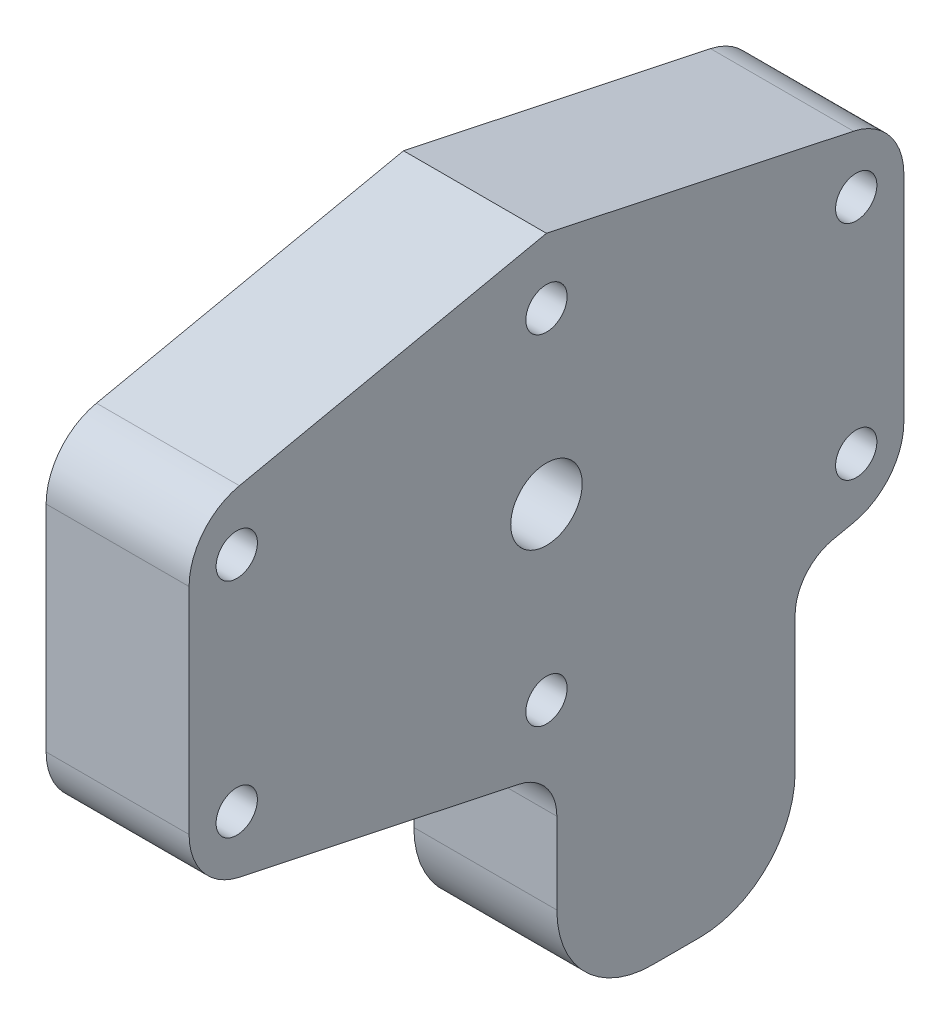
ISO-10303-21;
HEADER;
FILE_DESCRIPTION(('STEP AP214'),'2;1');
FILE_NAME('part.step','',(''),(''),'','','');
FILE_SCHEMA(('AUTOMOTIVE_DESIGN { 1 0 10303 214 1 1 1 1 }'));
ENDSEC;
DATA;
#1=APPLICATION_CONTEXT('core data for automotive mechanical design processes');
#2=APPLICATION_PROTOCOL_DEFINITION('international standard','automotive_design',2000,#1);
#3=PRODUCT_CONTEXT('',#1,'mechanical');
#4=PRODUCT('Part','Part','',(#3));
#5=PRODUCT_RELATED_PRODUCT_CATEGORY('part','',(#4));
#6=PRODUCT_DEFINITION_FORMATION('','',#4);
#7=PRODUCT_DEFINITION_CONTEXT('part definition',#1,'design');
#8=PRODUCT_DEFINITION('design','',#6,#7);
#9=PRODUCT_DEFINITION_SHAPE('','',#8);
#10=(LENGTH_UNIT() NAMED_UNIT(*) SI_UNIT(.MILLI.,.METRE.));
#11=(NAMED_UNIT(*) PLANE_ANGLE_UNIT() SI_UNIT($,.RADIAN.));
#12=(NAMED_UNIT(*) SI_UNIT($,.STERADIAN.) SOLID_ANGLE_UNIT());
#13=UNCERTAINTY_MEASURE_WITH_UNIT(LENGTH_MEASURE(1.E-05),#10,'distance_accuracy_value','');
#14=(GEOMETRIC_REPRESENTATION_CONTEXT(3) GLOBAL_UNCERTAINTY_ASSIGNED_CONTEXT((#13)) GLOBAL_UNIT_ASSIGNED_CONTEXT((#10,
#11,#12)) REPRESENTATION_CONTEXT('',''));
#15=CARTESIAN_POINT('',(0.,0.,0.));
#16=DIRECTION('',(0.,0.,1.));
#17=DIRECTION('',(1.,0.,0.));
#18=AXIS2_PLACEMENT_3D('',#15,#16,#17);
#19=CARTESIAN_POINT('',(9.,-28.2690306373786,-5.99265255801159));
#20=DIRECTION('',(0.,0.978260869565217,0.207378087264553));
#21=DIRECTION('',(0.,-0.207378087264554,0.978260869565218));
#22=AXIS2_PLACEMENT_3D('',#19,#20,#21);
#23=PLANE('',#22);
#24=DIRECTION('',(0.,0.207378087264554,-0.978260869565218));
#25=VECTOR('',#24,1.);
#26=CARTESIAN_POINT('',(9.,-28.2690306373786,-5.99265255801159));
#27=LINE('',#26,#25);
#28=CARTESIAN_POINT('',(9.,-20.9475712012116,-40.5300396512498));
#29=VERTEX_POINT('',#28);
#30=CARTESIAN_POINT('',(9.,-20.672100546187,-41.8295123490582));
#31=VERTEX_POINT('',#30);
#32=EDGE_CURVE('E195',#29,#31,#27,.T.);
#33=ORIENTED_EDGE('',*,*,#32,.F.);
#34=DIRECTION('',(1.,0.,0.));
#35=VECTOR('',#34,1.);
#36=CARTESIAN_POINT('',(9.,-20.9475712012116,-40.5300396512498));
#37=LINE('',#36,#35);
#38=CARTESIAN_POINT('',(0.,-20.9475712012116,-40.5300396512498));
#39=VERTEX_POINT('',#38);
#40=EDGE_CURVE('E299',#29,#39,#37,.F.);
#41=ORIENTED_EDGE('',*,*,#40,.T.);
#42=DIRECTION('',(0.,0.207378087264554,-0.978260869565218));
#43=VECTOR('',#42,1.);
#44=CARTESIAN_POINT('',(0.,-28.2690306373786,-5.99265255801159));
#45=LINE('',#44,#43);
#46=CARTESIAN_POINT('',(0.,-20.672100546187,-41.8295123490582));
#47=VERTEX_POINT('',#46);
#48=EDGE_CURVE('E226',#39,#47,#45,.T.);
#49=ORIENTED_EDGE('',*,*,#48,.T.);
#50=DIRECTION('',(-1.,0.,0.));
#51=VECTOR('',#50,1.);
#52=CARTESIAN_POINT('',(9.,-20.672100546187,-41.8295123490582));
#53=LINE('',#52,#51);
#54=EDGE_CURVE('E275',#47,#31,#53,.F.);
#55=ORIENTED_EDGE('',*,*,#54,.T.);
#56=EDGE_LOOP('',(#33,#41,#49,#55));
#57=FACE_BOUND('',#56,.T.);
#58=ADVANCED_FACE('F35',(#57),#23,.F.);
#59=CARTESIAN_POINT('',(9.,0.,-45.));
#60=DIRECTION('',(0.,0.,-1.));
#61=DIRECTION('',(-1.,0.,0.));
#62=AXIS2_PLACEMENT_3D('',#59,#60,#61);
#63=PLANE('',#62);
#64=DIRECTION('',(0.,-1.,0.));
#65=VECTOR('',#64,1.);
#66=CARTESIAN_POINT('',(9.,0.,-45.));
#67=LINE('',#66,#65);
#68=CARTESIAN_POINT('',(9.,-3.24094293207383,-45.));
#69=VERTEX_POINT('',#68);
#70=CARTESIAN_POINT('',(9.,-16.7590570679262,-45.));
#71=VERTEX_POINT('',#70);
#72=EDGE_CURVE('E184',#69,#71,#67,.T.);
#73=ORIENTED_EDGE('',*,*,#72,.T.);
#74=DIRECTION('',(-1.,0.,0.));
#75=VECTOR('',#74,1.);
#76=CARTESIAN_POINT('',(0.,-16.7590570679262,-45.));
#77=LINE('',#76,#75);
#78=CARTESIAN_POINT('',(0.,-16.7590570679262,-45.));
#79=VERTEX_POINT('',#78);
#80=EDGE_CURVE('E263',#71,#79,#77,.T.);
#81=ORIENTED_EDGE('',*,*,#80,.T.);
#82=DIRECTION('',(0.,-1.,0.));
#83=VECTOR('',#82,1.);
#84=CARTESIAN_POINT('',(0.,0.,-45.));
#85=LINE('',#84,#83);
#86=CARTESIAN_POINT('',(0.,-3.24094293207383,-45.));
#87=VERTEX_POINT('',#86);
#88=EDGE_CURVE('E214',#87,#79,#85,.T.);
#89=ORIENTED_EDGE('',*,*,#88,.F.);
#90=DIRECTION('',(-1.,0.,0.));
#91=VECTOR('',#90,1.);
#92=CARTESIAN_POINT('',(9.,-3.24094293207383,-45.));
#93=LINE('',#92,#91);
#94=EDGE_CURVE('E261',#87,#69,#93,.F.);
#95=ORIENTED_EDGE('',*,*,#94,.T.);
#96=EDGE_LOOP('',(#73,#81,#89,#95));
#97=FACE_BOUND('',#96,.T.);
#98=ADVANCED_FACE('F374',(#97),#63,.T.);
#99=CARTESIAN_POINT('',(9.,9.12914405892871,-1.93525519848772));
#100=DIRECTION('',(0.,0.978260869565217,-0.207378087264554));
#101=DIRECTION('',(0.,0.207378087264554,0.978260869565218));
#102=AXIS2_PLACEMENT_3D('',#99,#100,#101);
#103=PLANE('',#102);
#104=DIRECTION('',(0.,-0.207378087264554,-0.978260869565218));
#105=VECTOR('',#104,1.);
#106=CARTESIAN_POINT('',(9.,9.12914405892871,-1.93525519848772));
#107=LINE('',#106,#105);
#108=CARTESIAN_POINT('',(9.,4.76969600708473,-22.5));
#109=VERTEX_POINT('',#108);
#110=CARTESIAN_POINT('',(9.,0.672100546187042,-41.8295123490582));
#111=VERTEX_POINT('',#110);
#112=EDGE_CURVE('E159',#109,#111,#107,.T.);
#113=ORIENTED_EDGE('',*,*,#112,.T.);
#114=DIRECTION('',(-1.,0.,0.));
#115=VECTOR('',#114,1.);
#116=CARTESIAN_POINT('',(9.,0.672100546187042,-41.8295123490582));
#117=LINE('',#116,#115);
#118=CARTESIAN_POINT('',(0.,0.672100546187042,-41.8295123490582));
#119=VERTEX_POINT('',#118);
#120=EDGE_CURVE('E285',#111,#119,#117,.T.);
#121=ORIENTED_EDGE('',*,*,#120,.T.);
#122=DIRECTION('',(0.,-0.207378087264554,-0.978260869565218));
#123=VECTOR('',#122,1.);
#124=CARTESIAN_POINT('',(0.,9.12914405892871,-1.93525519848772));
#125=LINE('',#124,#123);
#126=CARTESIAN_POINT('',(0.,4.76969600708473,-22.5));
#127=VERTEX_POINT('',#126);
#128=EDGE_CURVE('E162',#127,#119,#125,.T.);
#129=ORIENTED_EDGE('',*,*,#128,.F.);
#130=DIRECTION('',(-1.,0.,0.));
#131=VECTOR('',#130,1.);
#132=CARTESIAN_POINT('',(9.,4.76969600708473,-22.5));
#133=LINE('',#132,#131);
#134=EDGE_CURVE('E154',#109,#127,#133,.T.);
#135=ORIENTED_EDGE('',*,*,#134,.F.);
#136=EDGE_LOOP('',(#113,#121,#129,#135));
#137=FACE_BOUND('',#136,.T.);
#138=ADVANCED_FACE('F156',(#137),#103,.T.);
#139=CARTESIAN_POINT('',(9.,0.,0.));
#140=DIRECTION('',(0.,-0.978260869565217,-0.207378087264554));
#141=DIRECTION('',(0.,0.207378087264554,-0.978260869565218));
#142=AXIS2_PLACEMENT_3D('',#139,#140,#141);
#143=PLANE('',#142);
#144=DIRECTION('',(0.,-0.207378087264554,0.978260869565218));
#145=VECTOR('',#144,1.);
#146=CARTESIAN_POINT('',(0.,0.,0.));
#147=LINE('',#146,#145);
#148=CARTESIAN_POINT('',(0.,0.672100546187044,-3.17048765094179));
#149=VERTEX_POINT('',#148);
#150=EDGE_CURVE('E219',#127,#149,#147,.T.);
#151=ORIENTED_EDGE('',*,*,#150,.T.);
#152=DIRECTION('',(-1.,0.,0.));
#153=VECTOR('',#152,1.);
#154=CARTESIAN_POINT('',(9.,0.672100546187044,-3.17048765094179));
#155=LINE('',#154,#153);
#156=CARTESIAN_POINT('',(9.,0.672100546187044,-3.17048765094179));
#157=VERTEX_POINT('',#156);
#158=EDGE_CURVE('E173',#149,#157,#155,.F.);
#159=ORIENTED_EDGE('',*,*,#158,.T.);
#160=DIRECTION('',(0.,-0.207378087264554,0.978260869565218));
#161=VECTOR('',#160,1.);
#162=CARTESIAN_POINT('',(9.,0.,0.));
#163=LINE('',#162,#161);
#164=EDGE_CURVE('E170',#109,#157,#163,.T.);
#165=ORIENTED_EDGE('',*,*,#164,.F.);
#166=ORIENTED_EDGE('',*,*,#134,.T.);
#167=EDGE_LOOP('',(#151,#159,#165,#166));
#168=FACE_BOUND('',#167,.T.);
#169=ADVANCED_FACE('F171',(#168),#143,.F.);
#170=CARTESIAN_POINT('',(9.,0.,0.));
#171=DIRECTION('',(0.,0.,-1.));
#172=DIRECTION('',(0.,1.,0.));
#173=AXIS2_PLACEMENT_3D('',#170,#171,#172);
#174=PLANE('',#173);
#175=DIRECTION('',(0.,-1.,0.));
#176=VECTOR('',#175,1.);
#177=CARTESIAN_POINT('',(9.,0.,0.));
#178=LINE('',#177,#176);
#179=CARTESIAN_POINT('',(9.,-3.24094293207383,0.));
#180=VERTEX_POINT('',#179);
#181=CARTESIAN_POINT('',(9.,-16.7590570679262,0.));
#182=VERTEX_POINT('',#181);
#183=EDGE_CURVE('E176',#180,#182,#178,.T.);
#184=ORIENTED_EDGE('',*,*,#183,.F.);
#185=DIRECTION('',(-1.,0.,0.));
#186=VECTOR('',#185,1.);
#187=CARTESIAN_POINT('',(9.,-3.24094293207383,0.));
#188=LINE('',#187,#186);
#189=CARTESIAN_POINT('',(0.,-3.24094293207383,0.));
#190=VERTEX_POINT('',#189);
#191=EDGE_CURVE('E289',#180,#190,#188,.T.);
#192=ORIENTED_EDGE('',*,*,#191,.T.);
#193=DIRECTION('',(0.,-1.,0.));
#194=VECTOR('',#193,1.);
#195=CARTESIAN_POINT('',(0.,0.,0.));
#196=LINE('',#195,#194);
#197=CARTESIAN_POINT('',(0.,-16.7590570679262,0.));
#198=VERTEX_POINT('',#197);
#199=EDGE_CURVE('E221',#190,#198,#196,.T.);
#200=ORIENTED_EDGE('',*,*,#199,.T.);
#201=DIRECTION('',(-1.,0.,0.));
#202=VECTOR('',#201,1.);
#203=CARTESIAN_POINT('',(9.,-16.7590570679262,0.));
#204=LINE('',#203,#202);
#205=EDGE_CURVE('E287',#198,#182,#204,.F.);
#206=ORIENTED_EDGE('',*,*,#205,.T.);
#207=EDGE_LOOP('',(#184,#192,#200,#206));
#208=FACE_BOUND('',#207,.T.);
#209=ADVANCED_FACE('F391',(#208),#174,.F.);
#210=CARTESIAN_POINT('',(9.,-19.1398865784499,4.05739735952387));
#211=DIRECTION('',(0.,0.978260869565217,-0.207378087264553));
#212=DIRECTION('',(0.,0.207378087264554,0.978260869565218));
#213=AXIS2_PLACEMENT_3D('',#210,#211,#212);
#214=PLANE('',#213);
#215=DIRECTION('',(0.,-0.207378087264554,-0.978260869565218));
#216=VECTOR('',#215,1.);
#217=CARTESIAN_POINT('',(0.,-19.1398865784499,4.05739735952387));
#218=LINE('',#217,#216);
#219=CARTESIAN_POINT('',(0.,-20.672100546187,-3.17048765094179));
#220=VERTEX_POINT('',#219);
#221=CARTESIAN_POINT('',(0.,-24.4038726556208,-20.7743081748371));
#222=VERTEX_POINT('',#221);
#223=EDGE_CURVE('E224',#220,#222,#218,.T.);
#224=ORIENTED_EDGE('',*,*,#223,.T.);
#225=DIRECTION('',(-1.,0.,0.));
#226=VECTOR('',#225,1.);
#227=CARTESIAN_POINT('',(9.,-24.4038726556208,-20.7743081748371));
#228=LINE('',#227,#226);
#229=CARTESIAN_POINT('',(9.,-24.4038726556208,-20.7743081748371));
#230=VERTEX_POINT('',#229);
#231=EDGE_CURVE('E56',#222,#230,#228,.F.);
#232=ORIENTED_EDGE('',*,*,#231,.T.);
#233=DIRECTION('',(0.,-0.207378087264554,-0.978260869565218));
#234=VECTOR('',#233,1.);
#235=CARTESIAN_POINT('',(9.,-19.1398865784499,4.05739735952387));
#236=LINE('',#235,#234);
#237=CARTESIAN_POINT('',(9.,-20.672100546187,-3.17048765094179));
#238=VERTEX_POINT('',#237);
#239=EDGE_CURVE('E193',#238,#230,#236,.T.);
#240=ORIENTED_EDGE('',*,*,#239,.F.);
#241=DIRECTION('',(-1.,0.,0.));
#242=VECTOR('',#241,1.);
#243=CARTESIAN_POINT('',(9.,-20.672100546187,-3.17048765094179));
#244=LINE('',#243,#242);
#245=EDGE_CURVE('E293',#238,#220,#244,.T.);
#246=ORIENTED_EDGE('',*,*,#245,.T.);
#247=EDGE_LOOP('',(#224,#232,#240,#246));
#248=FACE_BOUND('',#247,.T.);
#249=ADVANCED_FACE('F387',(#248),#214,.F.);
#250=CARTESIAN_POINT('',(9.,-17.0000000000008,-3.));
#251=DIRECTION('',(-1.,0.,0.));
#252=DIRECTION('',(0.,0.,1.));
#253=AXIS2_PLACEMENT_3D('',#250,#251,#252);
#254=CYLINDRICAL_SURFACE('',#253,1.3);
#255=CARTESIAN_POINT('',(9.,-17.0000000000008,-3.));
#256=DIRECTION('',(1.,0.,0.));
#257=DIRECTION('',(0.,0.,-1.));
#258=AXIS2_PLACEMENT_3D('',#255,#256,#257);
#259=CIRCLE('',#258,1.3);
#260=CARTESIAN_POINT('',(9.,-17.0000000000008,-4.3));
#261=VERTEX_POINT('',#260);
#262=EDGE_CURVE('E206',#261,#261,#259,.T.);
#263=ORIENTED_EDGE('',*,*,#262,.T.);
#264=EDGE_LOOP('',(#263));
#265=FACE_BOUND('',#264,.T.);
#266=CARTESIAN_POINT('',(0.,-17.0000000000008,-3.));
#267=DIRECTION('',(1.,0.,0.));
#268=DIRECTION('',(0.,0.,-1.));
#269=AXIS2_PLACEMENT_3D('',#266,#267,#268);
#270=CIRCLE('',#269,1.3);
#271=CARTESIAN_POINT('',(0.,-17.0000000000008,-4.3));
#272=VERTEX_POINT('',#271);
#273=EDGE_CURVE('E237',#272,#272,#270,.T.);
#274=ORIENTED_EDGE('',*,*,#273,.F.);
#275=EDGE_LOOP('',(#274));
#276=FACE_BOUND('',#275,.T.);
#277=ADVANCED_FACE('F390',(#265,#276),#254,.F.);
#278=CARTESIAN_POINT('',(9.,-3.00000000000081,-2.99999999999995));
#279=DIRECTION('',(-1.,0.,0.));
#280=DIRECTION('',(0.,0.,1.));
#281=AXIS2_PLACEMENT_3D('',#278,#279,#280);
#282=CYLINDRICAL_SURFACE('',#281,1.3);
#283=CARTESIAN_POINT('',(9.,-3.00000000000081,-2.99999999999995));
#284=DIRECTION('',(1.,0.,0.));
#285=DIRECTION('',(0.,0.,-1.));
#286=AXIS2_PLACEMENT_3D('',#283,#284,#285);
#287=CIRCLE('',#286,1.3);
#288=CARTESIAN_POINT('',(9.,-3.00000000000081,-4.29999999999995));
#289=VERTEX_POINT('',#288);
#290=EDGE_CURVE('E203',#289,#289,#287,.T.);
#291=ORIENTED_EDGE('',*,*,#290,.T.);
#292=EDGE_LOOP('',(#291));
#293=FACE_BOUND('',#292,.T.);
#294=CARTESIAN_POINT('',(0.,-3.00000000000081,-2.99999999999995));
#295=DIRECTION('',(1.,0.,0.));
#296=DIRECTION('',(0.,0.,-1.));
#297=AXIS2_PLACEMENT_3D('',#294,#295,#296);
#298=CIRCLE('',#297,1.3);
#299=CARTESIAN_POINT('',(0.,-3.00000000000081,-4.29999999999995));
#300=VERTEX_POINT('',#299);
#301=EDGE_CURVE('E234',#300,#300,#298,.T.);
#302=ORIENTED_EDGE('',*,*,#301,.F.);
#303=EDGE_LOOP('',(#302));
#304=FACE_BOUND('',#303,.T.);
#305=ADVANCED_FACE('F684',(#293,#304),#282,.F.);
#306=CARTESIAN_POINT('',(9.,-3.,-42.));
#307=DIRECTION('',(-1.,0.,0.));
#308=DIRECTION('',(0.,0.,1.));
#309=AXIS2_PLACEMENT_3D('',#306,#307,#308);
#310=CYLINDRICAL_SURFACE('',#309,1.3);
#311=CARTESIAN_POINT('',(9.,-3.,-42.));
#312=DIRECTION('',(1.,0.,0.));
#313=DIRECTION('',(0.,0.,-1.));
#314=AXIS2_PLACEMENT_3D('',#311,#312,#313);
#315=CIRCLE('',#314,1.3);
#316=CARTESIAN_POINT('',(9.,-3.,-43.2999999999999));
#317=VERTEX_POINT('',#316);
#318=EDGE_CURVE('E200',#317,#317,#315,.T.);
#319=ORIENTED_EDGE('',*,*,#318,.T.);
#320=EDGE_LOOP('',(#319));
#321=FACE_BOUND('',#320,.T.);
#322=CARTESIAN_POINT('',(0.,-3.,-42.));
#323=DIRECTION('',(1.,0.,0.));
#324=DIRECTION('',(0.,0.,-1.));
#325=AXIS2_PLACEMENT_3D('',#322,#323,#324);
#326=CIRCLE('',#325,1.3);
#327=CARTESIAN_POINT('',(0.,-3.,-43.2999999999999));
#328=VERTEX_POINT('',#327);
#329=EDGE_CURVE('E231',#328,#328,#326,.T.);
#330=ORIENTED_EDGE('',*,*,#329,.F.);
#331=EDGE_LOOP('',(#330));
#332=FACE_BOUND('',#331,.T.);
#333=ADVANCED_FACE('F676',(#321,#332),#310,.F.);
#334=CARTESIAN_POINT('',(9.,0.680807118195843,-22.5));
#335=DIRECTION('',(-1.,0.,0.));
#336=DIRECTION('',(0.,0.,1.));
#337=AXIS2_PLACEMENT_3D('',#334,#335,#336);
#338=CYLINDRICAL_SURFACE('',#337,1.3);
#339=CARTESIAN_POINT('',(9.,0.680807118195843,-22.5));
#340=DIRECTION('',(1.,0.,0.));
#341=DIRECTION('',(0.,0.,-1.));
#342=AXIS2_PLACEMENT_3D('',#339,#340,#341);
#343=CIRCLE('',#342,1.3);
#344=CARTESIAN_POINT('',(9.,0.680807118195843,-23.8));
#345=VERTEX_POINT('',#344);
#346=EDGE_CURVE('E197',#345,#345,#343,.T.);
#347=ORIENTED_EDGE('',*,*,#346,.T.);
#348=EDGE_LOOP('',(#347));
#349=FACE_BOUND('',#348,.T.);
#350=CARTESIAN_POINT('',(0.,0.680807118195843,-22.5));
#351=DIRECTION('',(1.,0.,0.));
#352=DIRECTION('',(0.,0.,-1.));
#353=AXIS2_PLACEMENT_3D('',#350,#351,#352);
#354=CIRCLE('',#353,1.3);
#355=CARTESIAN_POINT('',(0.,0.680807118195843,-23.8));
#356=VERTEX_POINT('',#355);
#357=EDGE_CURVE('E228',#356,#356,#354,.T.);
#358=ORIENTED_EDGE('',*,*,#357,.F.);
#359=EDGE_LOOP('',(#358));
#360=FACE_BOUND('',#359,.T.);
#361=ADVANCED_FACE('F385',(#349,#360),#338,.F.);
#362=CARTESIAN_POINT('',(9.,-20.6808071181958,-22.5));
#363=DIRECTION('',(-1.,0.,0.));
#364=DIRECTION('',(0.,0.,1.));
#365=AXIS2_PLACEMENT_3D('',#362,#363,#364);
#366=CYLINDRICAL_SURFACE('',#365,1.3);
#367=CARTESIAN_POINT('',(9.,-20.6808071181958,-22.5));
#368=DIRECTION('',(1.,0.,0.));
#369=DIRECTION('',(0.,0.,-1.));
#370=AXIS2_PLACEMENT_3D('',#367,#368,#369);
#371=CIRCLE('',#370,1.3);
#372=CARTESIAN_POINT('',(9.,-20.6808071181958,-23.8));
#373=VERTEX_POINT('',#372);
#374=EDGE_CURVE('E187',#373,#373,#371,.T.);
#375=ORIENTED_EDGE('',*,*,#374,.T.);
#376=EDGE_LOOP('',(#375));
#377=FACE_BOUND('',#376,.T.);
#378=CARTESIAN_POINT('',(0.,-20.6808071181958,-22.5));
#379=DIRECTION('',(1.,0.,0.));
#380=DIRECTION('',(0.,0.,-1.));
#381=AXIS2_PLACEMENT_3D('',#378,#379,#380);
#382=CIRCLE('',#381,1.3);
#383=CARTESIAN_POINT('',(0.,-20.6808071181958,-23.8));
#384=VERTEX_POINT('',#383);
#385=EDGE_CURVE('E211',#384,#384,#382,.T.);
#386=ORIENTED_EDGE('',*,*,#385,.F.);
#387=EDGE_LOOP('',(#386));
#388=FACE_BOUND('',#387,.T.);
#389=ADVANCED_FACE('F356',(#377,#388),#366,.F.);
#390=CARTESIAN_POINT('',(9.,-17.,-42.));
#391=DIRECTION('',(-1.,0.,0.));
#392=DIRECTION('',(0.,0.,1.));
#393=AXIS2_PLACEMENT_3D('',#390,#391,#392);
#394=CYLINDRICAL_SURFACE('',#393,1.3);
#395=CARTESIAN_POINT('',(9.,-17.,-42.));
#396=DIRECTION('',(1.,0.,0.));
#397=DIRECTION('',(0.,0.,-1.));
#398=AXIS2_PLACEMENT_3D('',#395,#396,#397);
#399=CIRCLE('',#398,1.3);
#400=CARTESIAN_POINT('',(9.,-17.,-43.3));
#401=VERTEX_POINT('',#400);
#402=EDGE_CURVE('E167',#401,#401,#399,.T.);
#403=ORIENTED_EDGE('',*,*,#402,.T.);
#404=EDGE_LOOP('',(#403));
#405=FACE_BOUND('',#404,.T.);
#406=CARTESIAN_POINT('',(0.,-17.,-42.));
#407=DIRECTION('',(1.,0.,0.));
#408=DIRECTION('',(0.,0.,-1.));
#409=AXIS2_PLACEMENT_3D('',#406,#407,#408);
#410=CIRCLE('',#409,1.3);
#411=CARTESIAN_POINT('',(0.,-17.,-43.3));
#412=VERTEX_POINT('',#411);
#413=EDGE_CURVE('E240',#412,#412,#410,.T.);
#414=ORIENTED_EDGE('',*,*,#413,.F.);
#415=EDGE_LOOP('',(#414));
#416=FACE_BOUND('',#415,.T.);
#417=ADVANCED_FACE('F360',(#405,#416),#394,.F.);
#418=CARTESIAN_POINT('',(9.,0.,0.));
#419=DIRECTION('',(1.,0.,0.));
#420=DIRECTION('',(0.,0.,-1.));
#421=AXIS2_PLACEMENT_3D('',#418,#419,#420);
#422=PLANE('',#421);
#423=CARTESIAN_POINT('',(9.,-10.,-22.5));
#424=DIRECTION('',(-1.,0.,0.));
#425=DIRECTION('',(0.,0.,1.));
#426=AXIS2_PLACEMENT_3D('',#423,#424,#425);
#427=CIRCLE('',#426,2.25);
#428=CARTESIAN_POINT('',(9.,-10.,-20.25));
#429=VERTEX_POINT('',#428);
#430=EDGE_CURVE('E338',#429,#429,#427,.T.);
#431=ORIENTED_EDGE('',*,*,#430,.T.);
#432=EDGE_LOOP('',(#431));
#433=FACE_BOUND('',#432,.T.);
#434=ORIENTED_EDGE('',*,*,#374,.F.);
#435=EDGE_LOOP('',(#434));
#436=FACE_BOUND('',#435,.T.);
#437=DIRECTION('',(0.,1.,0.));
#438=VECTOR('',#437,1.);
#439=CARTESIAN_POINT('',(9.,-21.4516466108519,-38.1521739130435));
#440=LINE('',#439,#438);
#441=CARTESIAN_POINT('',(9.,-32.4516466108519,-38.1521739130435));
#442=VERTEX_POINT('',#441);
#443=CARTESIAN_POINT('',(9.,-23.8823538099072,-38.1521739130435));
#444=VERTEX_POINT('',#443);
#445=EDGE_CURVE('E322',#442,#444,#440,.T.);
#446=ORIENTED_EDGE('',*,*,#445,.T.);
#447=CARTESIAN_POINT('',(9.,-23.8823538099072,-41.1521739130435));
#448=DIRECTION('',(1.,0.,0.));
#449=DIRECTION('',(0.,0.,-1.));
#450=AXIS2_PLACEMENT_3D('',#447,#448,#449);
#451=CIRCLE('',#450,3.);
#452=EDGE_CURVE('E301',#444,#29,#451,.F.);
#453=ORIENTED_EDGE('',*,*,#452,.T.);
#454=ORIENTED_EDGE('',*,*,#32,.T.);
#455=CARTESIAN_POINT('',(9.,-16.7590570679262,-41.));
#456=DIRECTION('',(1.,0.,0.));
#457=DIRECTION('',(0.,0.,-1.));
#458=AXIS2_PLACEMENT_3D('',#455,#456,#457);
#459=CIRCLE('',#458,4.);
#460=EDGE_CURVE('E283',#31,#71,#459,.T.);
#461=ORIENTED_EDGE('',*,*,#460,.T.);
#462=ORIENTED_EDGE('',*,*,#72,.F.);
#463=CARTESIAN_POINT('',(9.,-3.24094293207383,-41.));
#464=DIRECTION('',(1.,0.,0.));
#465=DIRECTION('',(0.,0.,-1.));
#466=AXIS2_PLACEMENT_3D('',#463,#464,#465);
#467=CIRCLE('',#466,4.);
#468=EDGE_CURVE('E183',#69,#111,#467,.T.);
#469=ORIENTED_EDGE('',*,*,#468,.T.);
#470=ORIENTED_EDGE('',*,*,#112,.F.);
#471=ORIENTED_EDGE('',*,*,#164,.T.);
#472=CARTESIAN_POINT('',(9.,-3.24094293207383,-4.));
#473=DIRECTION('',(1.,0.,0.));
#474=DIRECTION('',(0.,0.,-1.));
#475=AXIS2_PLACEMENT_3D('',#472,#473,#474);
#476=CIRCLE('',#475,4.);
#477=EDGE_CURVE('E280',#157,#180,#476,.T.);
#478=ORIENTED_EDGE('',*,*,#477,.T.);
#479=ORIENTED_EDGE('',*,*,#183,.T.);
#480=CARTESIAN_POINT('',(9.,-16.7590570679262,-4.));
#481=DIRECTION('',(1.,0.,0.));
#482=DIRECTION('',(0.,0.,-1.));
#483=AXIS2_PLACEMENT_3D('',#480,#481,#482);
#484=CIRCLE('',#483,4.);
#485=EDGE_CURVE('E278',#182,#238,#484,.T.);
#486=ORIENTED_EDGE('',*,*,#485,.T.);
#487=ORIENTED_EDGE('',*,*,#239,.T.);
#488=CARTESIAN_POINT('',(9.,-27.3386552643165,-20.1521739130435));
#489=DIRECTION('',(1.,0.,0.));
#490=DIRECTION('',(0.,0.,-1.));
#491=AXIS2_PLACEMENT_3D('',#488,#489,#490);
#492=CIRCLE('',#491,3.);
#493=CARTESIAN_POINT('',(9.,-27.3386552643165,-23.1521739130435));
#494=VERTEX_POINT('',#493);
#495=EDGE_CURVE('E11',#230,#494,#492,.F.);
#496=ORIENTED_EDGE('',*,*,#495,.T.);
#497=DIRECTION('',(0.,-1.,0.));
#498=VECTOR('',#497,1.);
#499=CARTESIAN_POINT('',(9.,-38.4516466108519,-23.1521739130435));
#500=LINE('',#499,#498);
#501=CARTESIAN_POINT('',(9.,-32.4516466108519,-23.1521739130435));
#502=VERTEX_POINT('',#501);
#503=EDGE_CURVE('E313',#494,#502,#500,.T.);
#504=ORIENTED_EDGE('',*,*,#503,.T.);
#505=CARTESIAN_POINT('',(9.,-32.4516466108519,-29.1521739130435));
#506=DIRECTION('',(1.,0.,0.));
#507=DIRECTION('',(0.,0.,-1.));
#508=AXIS2_PLACEMENT_3D('',#505,#506,#507);
#509=CIRCLE('',#508,6.);
#510=CARTESIAN_POINT('',(9.,-38.4516466108519,-29.1521739130435));
#511=VERTEX_POINT('',#510);
#512=EDGE_CURVE('E247',#502,#511,#509,.T.);
#513=ORIENTED_EDGE('',*,*,#512,.T.);
#514=DIRECTION('',(0.,0.,-1.));
#515=VECTOR('',#514,1.);
#516=CARTESIAN_POINT('',(9.,-38.4516466108519,-38.1521739130435));
#517=LINE('',#516,#515);
#518=CARTESIAN_POINT('',(9.,-38.4516466108519,-32.1521739130435));
#519=VERTEX_POINT('',#518);
#520=EDGE_CURVE('E327',#511,#519,#517,.T.);
#521=ORIENTED_EDGE('',*,*,#520,.T.);
#522=CARTESIAN_POINT('',(9.,-32.4516466108519,-32.1521739130435));
#523=DIRECTION('',(1.,0.,0.));
#524=DIRECTION('',(0.,0.,-1.));
#525=AXIS2_PLACEMENT_3D('',#522,#523,#524);
#526=CIRCLE('',#525,6.);
#527=EDGE_CURVE('E245',#519,#442,#526,.T.);
#528=ORIENTED_EDGE('',*,*,#527,.T.);
#529=EDGE_LOOP('',(#446,#453,#454,#461,#462,#469,#470,#471,#478,#479,#486,#487,#496,#504,#513,
#521,#528));
#530=FACE_BOUND('',#529,.T.);
#531=ORIENTED_EDGE('',*,*,#346,.F.);
#532=EDGE_LOOP('',(#531));
#533=FACE_BOUND('',#532,.T.);
#534=ORIENTED_EDGE('',*,*,#318,.F.);
#535=EDGE_LOOP('',(#534));
#536=FACE_BOUND('',#535,.T.);
#537=ORIENTED_EDGE('',*,*,#290,.F.);
#538=EDGE_LOOP('',(#537));
#539=FACE_BOUND('',#538,.T.);
#540=ORIENTED_EDGE('',*,*,#262,.F.);
#541=EDGE_LOOP('',(#540));
#542=FACE_BOUND('',#541,.T.);
#543=ORIENTED_EDGE('',*,*,#402,.F.);
#544=EDGE_LOOP('',(#543));
#545=FACE_BOUND('',#544,.T.);
#546=ADVANCED_FACE('F179',(#433,#436,#530,#533,#536,#539,#542,#545),#422,.T.);
#547=CARTESIAN_POINT('',(0.,0.,0.));
#548=DIRECTION('',(1.,0.,0.));
#549=DIRECTION('',(0.,0.,-1.));
#550=AXIS2_PLACEMENT_3D('',#547,#548,#549);
#551=PLANE('',#550);
#552=CARTESIAN_POINT('',(0.,-30.4516466108519,-30.6521739130435));
#553=DIRECTION('',(1.,0.,0.));
#554=DIRECTION('',(0.,0.,1.));
#555=AXIS2_PLACEMENT_3D('',#552,#553,#554);
#556=CIRCLE('',#555,5.2);
#557=CARTESIAN_POINT('',(0.,-30.4516466108519,-25.4521739130435));
#558=VERTEX_POINT('',#557);
#559=EDGE_CURVE('E330',#558,#558,#556,.T.);
#560=ORIENTED_EDGE('',*,*,#559,.T.);
#561=EDGE_LOOP('',(#560));
#562=FACE_BOUND('',#561,.T.);
#563=CARTESIAN_POINT('',(0.,-10.,-22.5));
#564=DIRECTION('',(-1.,0.,0.));
#565=DIRECTION('',(0.,0.,1.));
#566=AXIS2_PLACEMENT_3D('',#563,#564,#565);
#567=CIRCLE('',#566,8.1);
#568=CARTESIAN_POINT('',(0.,-10.,-14.4));
#569=VERTEX_POINT('',#568);
#570=EDGE_CURVE('E341',#569,#569,#567,.T.);
#571=ORIENTED_EDGE('',*,*,#570,.F.);
#572=EDGE_LOOP('',(#571));
#573=FACE_BOUND('',#572,.T.);
#574=CARTESIAN_POINT('',(0.,-10.,-8.5));
#575=DIRECTION('',(1.,0.,0.));
#576=DIRECTION('',(0.,0.,1.));
#577=AXIS2_PLACEMENT_3D('',#574,#575,#576);
#578=CIRCLE('',#577,5.2);
#579=CARTESIAN_POINT('',(0.,-10.,-3.29999999999999));
#580=VERTEX_POINT('',#579);
#581=EDGE_CURVE('E347',#580,#580,#578,.T.);
#582=ORIENTED_EDGE('',*,*,#581,.T.);
#583=EDGE_LOOP('',(#582));
#584=FACE_BOUND('',#583,.T.);
#585=CARTESIAN_POINT('',(0.,-10.,-36.5));
#586=DIRECTION('',(1.,0.,0.));
#587=DIRECTION('',(0.,0.,1.));
#588=AXIS2_PLACEMENT_3D('',#585,#586,#587);
#589=CIRCLE('',#588,5.2);
#590=CARTESIAN_POINT('',(0.,-10.,-31.3));
#591=VERTEX_POINT('',#590);
#592=EDGE_CURVE('E215',#591,#591,#589,.T.);
#593=ORIENTED_EDGE('',*,*,#592,.T.);
#594=EDGE_LOOP('',(#593));
#595=FACE_BOUND('',#594,.T.);
#596=ORIENTED_EDGE('',*,*,#385,.T.);
#597=EDGE_LOOP('',(#596));
#598=FACE_BOUND('',#597,.T.);
#599=ORIENTED_EDGE('',*,*,#88,.T.);
#600=CARTESIAN_POINT('',(0.,-16.7590570679262,-41.));
#601=DIRECTION('',(1.,0.,0.));
#602=DIRECTION('',(0.,0.,-1.));
#603=AXIS2_PLACEMENT_3D('',#600,#601,#602);
#604=CIRCLE('',#603,4.);
#605=EDGE_CURVE('E272',#79,#47,#604,.F.);
#606=ORIENTED_EDGE('',*,*,#605,.T.);
#607=ORIENTED_EDGE('',*,*,#48,.F.);
#608=CARTESIAN_POINT('',(0.,-23.8823538099072,-41.1521739130435));
#609=DIRECTION('',(1.,0.,0.));
#610=DIRECTION('',(0.,0.,-1.));
#611=AXIS2_PLACEMENT_3D('',#608,#609,#610);
#612=CIRCLE('',#611,3.);
#613=CARTESIAN_POINT('',(0.,-23.8823538099072,-38.1521739130435));
#614=VERTEX_POINT('',#613);
#615=EDGE_CURVE('E303',#39,#614,#612,.T.);
#616=ORIENTED_EDGE('',*,*,#615,.T.);
#617=DIRECTION('',(0.,1.,0.));
#618=VECTOR('',#617,1.);
#619=CARTESIAN_POINT('',(0.,-21.4516466108519,-38.1521739130435));
#620=LINE('',#619,#618);
#621=CARTESIAN_POINT('',(0.,-32.4516466108519,-38.1521739130435));
#622=VERTEX_POINT('',#621);
#623=EDGE_CURVE('E325',#622,#614,#620,.T.);
#624=ORIENTED_EDGE('',*,*,#623,.F.);
#625=CARTESIAN_POINT('',(0.,-32.4516466108519,-32.1521739130435));
#626=DIRECTION('',(1.,0.,0.));
#627=DIRECTION('',(0.,0.,-1.));
#628=AXIS2_PLACEMENT_3D('',#625,#626,#627);
#629=CIRCLE('',#628,6.);
#630=CARTESIAN_POINT('',(0.,-38.4516466108519,-32.1521739130435));
#631=VERTEX_POINT('',#630);
#632=EDGE_CURVE('E254',#622,#631,#629,.F.);
#633=ORIENTED_EDGE('',*,*,#632,.T.);
#634=DIRECTION('',(0.,0.,-1.));
#635=VECTOR('',#634,1.);
#636=CARTESIAN_POINT('',(0.,-38.4516466108519,-38.1521739130435));
#637=LINE('',#636,#635);
#638=CARTESIAN_POINT('',(0.,-38.4516466108519,-29.1521739130435));
#639=VERTEX_POINT('',#638);
#640=EDGE_CURVE('E321',#639,#631,#637,.T.);
#641=ORIENTED_EDGE('',*,*,#640,.F.);
#642=CARTESIAN_POINT('',(0.,-32.4516466108519,-29.1521739130435));
#643=DIRECTION('',(1.,0.,0.));
#644=DIRECTION('',(0.,0.,-1.));
#645=AXIS2_PLACEMENT_3D('',#642,#643,#644);
#646=CIRCLE('',#645,6.);
#647=CARTESIAN_POINT('',(0.,-32.4516466108519,-23.1521739130435));
#648=VERTEX_POINT('',#647);
#649=EDGE_CURVE('E256',#639,#648,#646,.F.);
#650=ORIENTED_EDGE('',*,*,#649,.T.);
#651=DIRECTION('',(0.,-1.,0.));
#652=VECTOR('',#651,1.);
#653=CARTESIAN_POINT('',(0.,-38.4516466108519,-23.1521739130435));
#654=LINE('',#653,#652);
#655=CARTESIAN_POINT('',(0.,-27.3386552643165,-23.1521739130435));
#656=VERTEX_POINT('',#655);
#657=EDGE_CURVE('E312',#656,#648,#654,.T.);
#658=ORIENTED_EDGE('',*,*,#657,.F.);
#659=CARTESIAN_POINT('',(0.,-27.3386552643165,-20.1521739130435));
#660=DIRECTION('',(1.,0.,0.));
#661=DIRECTION('',(0.,0.,-1.));
#662=AXIS2_PLACEMENT_3D('',#659,#660,#661);
#663=CIRCLE('',#662,3.);
#664=EDGE_CURVE('E43',#656,#222,#663,.T.);
#665=ORIENTED_EDGE('',*,*,#664,.T.);
#666=ORIENTED_EDGE('',*,*,#223,.F.);
#667=CARTESIAN_POINT('',(0.,-16.7590570679262,-4.));
#668=DIRECTION('',(1.,0.,0.));
#669=DIRECTION('',(0.,0.,-1.));
#670=AXIS2_PLACEMENT_3D('',#667,#668,#669);
#671=CIRCLE('',#670,4.);
#672=EDGE_CURVE('E266',#220,#198,#671,.F.);
#673=ORIENTED_EDGE('',*,*,#672,.T.);
#674=ORIENTED_EDGE('',*,*,#199,.F.);
#675=CARTESIAN_POINT('',(0.,-3.24094293207383,-4.));
#676=DIRECTION('',(1.,0.,0.));
#677=DIRECTION('',(0.,0.,-1.));
#678=AXIS2_PLACEMENT_3D('',#675,#676,#677);
#679=CIRCLE('',#678,4.);
#680=EDGE_CURVE('E268',#190,#149,#679,.F.);
#681=ORIENTED_EDGE('',*,*,#680,.T.);
#682=ORIENTED_EDGE('',*,*,#150,.F.);
#683=ORIENTED_EDGE('',*,*,#128,.T.);
#684=CARTESIAN_POINT('',(0.,-3.24094293207383,-41.));
#685=DIRECTION('',(1.,0.,0.));
#686=DIRECTION('',(0.,0.,-1.));
#687=AXIS2_PLACEMENT_3D('',#684,#685,#686);
#688=CIRCLE('',#687,4.);
#689=EDGE_CURVE('E270',#119,#87,#688,.F.);
#690=ORIENTED_EDGE('',*,*,#689,.T.);
#691=EDGE_LOOP('',(#599,#606,#607,#616,#624,#633,#641,#650,#658,#665,#666,#673,#674,#681,#682,
#683,#690));
#692=FACE_BOUND('',#691,.T.);
#693=ORIENTED_EDGE('',*,*,#357,.T.);
#694=EDGE_LOOP('',(#693));
#695=FACE_BOUND('',#694,.T.);
#696=ORIENTED_EDGE('',*,*,#329,.T.);
#697=EDGE_LOOP('',(#696));
#698=FACE_BOUND('',#697,.T.);
#699=ORIENTED_EDGE('',*,*,#301,.T.);
#700=EDGE_LOOP('',(#699));
#701=FACE_BOUND('',#700,.T.);
#702=ORIENTED_EDGE('',*,*,#273,.T.);
#703=EDGE_LOOP('',(#702));
#704=FACE_BOUND('',#703,.T.);
#705=ORIENTED_EDGE('',*,*,#413,.T.);
#706=EDGE_LOOP('',(#705));
#707=FACE_BOUND('',#706,.T.);
#708=ADVANCED_FACE('F316',(#562,#573,#584,#595,#598,#692,#695,#698,#701,#704,#707),#551,.F.);
#709=CARTESIAN_POINT('',(0.,-10.,-36.5));
#710=DIRECTION('',(0.,0.,1.));
#711=DIRECTION('',(0.,1.,0.));
#712=AXIS2_PLACEMENT_3D('',#709,#710,#711);
#713=SPHERICAL_SURFACE('',#712,5.2);
#714=CARTESIAN_POINT('',(0.,-10.,-36.5));
#715=DIRECTION('',(1.,0.,0.));
#716=DIRECTION('',(0.,0.,1.));
#717=AXIS2_PLACEMENT_3D('',#714,#715,#716);
#718=SPHERICAL_SURFACE('',#717,5.2);
#719=ORIENTED_EDGE('',*,*,#592,.F.);
#720=EDGE_LOOP('',(#719));
#721=FACE_BOUND('',#720,.T.);
#722=ADVANCED_FACE('F367',(#721),#718,.F.);
#723=CARTESIAN_POINT('',(0.,-10.,-8.5));
#724=DIRECTION('',(0.,0.,1.));
#725=DIRECTION('',(0.,1.,0.));
#726=AXIS2_PLACEMENT_3D('',#723,#724,#725);
#727=SPHERICAL_SURFACE('',#726,5.2);
#728=CARTESIAN_POINT('',(0.,-10.,-8.5));
#729=DIRECTION('',(1.,0.,0.));
#730=DIRECTION('',(0.,0.,1.));
#731=AXIS2_PLACEMENT_3D('',#728,#729,#730);
#732=SPHERICAL_SURFACE('',#731,5.2);
#733=ORIENTED_EDGE('',*,*,#581,.F.);
#734=EDGE_LOOP('',(#733));
#735=FACE_BOUND('',#734,.T.);
#736=ADVANCED_FACE('F479',(#735),#732,.F.);
#737=CARTESIAN_POINT('',(5.5,-10.,-22.5));
#738=DIRECTION('',(-1.,0.,0.));
#739=DIRECTION('',(0.,0.,1.));
#740=AXIS2_PLACEMENT_3D('',#737,#738,#739);
#741=CYLINDRICAL_SURFACE('',#740,8.1);
#742=CARTESIAN_POINT('',(5.5,-10.,-22.5));
#743=DIRECTION('',(-1.,0.,0.));
#744=DIRECTION('',(0.,0.,1.));
#745=AXIS2_PLACEMENT_3D('',#742,#743,#744);
#746=CIRCLE('',#745,8.1);
#747=CARTESIAN_POINT('',(5.5,-10.,-14.4));
#748=VERTEX_POINT('',#747);
#749=EDGE_CURVE('E344',#748,#748,#746,.T.);
#750=ORIENTED_EDGE('',*,*,#749,.F.);
#751=EDGE_LOOP('',(#750));
#752=FACE_BOUND('',#751,.T.);
#753=ORIENTED_EDGE('',*,*,#570,.T.);
#754=EDGE_LOOP('',(#753));
#755=FACE_BOUND('',#754,.T.);
#756=ADVANCED_FACE('F475',(#752,#755),#741,.F.);
#757=CARTESIAN_POINT('',(5.5,-10.,-22.5));
#758=DIRECTION('',(-1.,0.,0.));
#759=DIRECTION('',(0.,0.,1.));
#760=AXIS2_PLACEMENT_3D('',#757,#758,#759);
#761=PLANE('',#760);
#762=CARTESIAN_POINT('',(5.5,-10.,-22.5));
#763=DIRECTION('',(-1.,0.,0.));
#764=DIRECTION('',(0.,0.,1.));
#765=AXIS2_PLACEMENT_3D('',#762,#763,#764);
#766=CIRCLE('',#765,2.25);
#767=CARTESIAN_POINT('',(5.5,-10.,-20.25));
#768=VERTEX_POINT('',#767);
#769=EDGE_CURVE('E334',#768,#768,#766,.T.);
#770=ORIENTED_EDGE('',*,*,#769,.F.);
#771=EDGE_LOOP('',(#770));
#772=FACE_BOUND('',#771,.T.);
#773=ORIENTED_EDGE('',*,*,#749,.T.);
#774=EDGE_LOOP('',(#773));
#775=FACE_BOUND('',#774,.T.);
#776=ADVANCED_FACE('F471',(#772,#775),#761,.T.);
#777=CARTESIAN_POINT('',(9.,-10.,-22.5));
#778=DIRECTION('',(-1.,0.,0.));
#779=DIRECTION('',(0.,0.,1.));
#780=AXIS2_PLACEMENT_3D('',#777,#778,#779);
#781=CYLINDRICAL_SURFACE('',#780,2.25);
#782=CARTESIAN_POINT('',(9.,-10.,-20.25));
#783=CARTESIAN_POINT('',(8.96354166666667,-10.,-20.25));
#784=CARTESIAN_POINT('',(8.92708333333333,-10.,-20.25));
#785=CARTESIAN_POINT('',(8.85416666666667,-10.,-20.25));
#786=CARTESIAN_POINT('',(8.81770833333333,-10.,-20.25));
#787=CARTESIAN_POINT('',(8.74479166666667,-10.,-20.25));
#788=CARTESIAN_POINT('',(8.70833333333333,-10.,-20.25));
#789=CARTESIAN_POINT('',(8.63541666666667,-10.,-20.25));
#790=CARTESIAN_POINT('',(8.59895833333333,-10.,-20.25));
#791=CARTESIAN_POINT('',(8.52604166666667,-10.,-20.25));
#792=CARTESIAN_POINT('',(8.48958333333333,-10.,-20.25));
#793=CARTESIAN_POINT('',(8.41666666666667,-10.,-20.25));
#794=CARTESIAN_POINT('',(8.38020833333333,-10.,-20.25));
#795=CARTESIAN_POINT('',(8.30729166666667,-10.,-20.25));
#796=CARTESIAN_POINT('',(8.27083333333333,-10.,-20.25));
#797=CARTESIAN_POINT('',(8.19791666666667,-10.,-20.25));
#798=CARTESIAN_POINT('',(8.16145833333333,-10.,-20.25));
#799=CARTESIAN_POINT('',(8.08854166666667,-10.,-20.25));
#800=CARTESIAN_POINT('',(8.05208333333333,-10.,-20.25));
#801=CARTESIAN_POINT('',(7.97916666666667,-10.,-20.25));
#802=CARTESIAN_POINT('',(7.94270833333333,-10.,-20.25));
#803=CARTESIAN_POINT('',(7.86979166666667,-10.,-20.25));
#804=CARTESIAN_POINT('',(7.83333333333333,-10.,-20.25));
#805=CARTESIAN_POINT('',(7.76041666666667,-10.,-20.25));
#806=CARTESIAN_POINT('',(7.72395833333333,-10.,-20.25));
#807=CARTESIAN_POINT('',(7.65104166666667,-10.,-20.25));
#808=CARTESIAN_POINT('',(7.61458333333333,-10.,-20.25));
#809=CARTESIAN_POINT('',(7.54166666666667,-10.,-20.25));
#810=CARTESIAN_POINT('',(7.50520833333333,-10.,-20.25));
#811=CARTESIAN_POINT('',(7.43229166666667,-10.,-20.25));
#812=CARTESIAN_POINT('',(7.39583333333333,-10.,-20.25));
#813=CARTESIAN_POINT('',(7.32291666666667,-10.,-20.25));
#814=CARTESIAN_POINT('',(7.28645833333333,-10.,-20.25));
#815=CARTESIAN_POINT('',(7.21354166666667,-10.,-20.25));
#816=CARTESIAN_POINT('',(7.17708333333333,-10.,-20.25));
#817=CARTESIAN_POINT('',(7.10416666666667,-10.,-20.25));
#818=CARTESIAN_POINT('',(7.06770833333333,-10.,-20.25));
#819=CARTESIAN_POINT('',(6.99479166666667,-10.,-20.25));
#820=CARTESIAN_POINT('',(6.95833333333333,-10.,-20.25));
#821=CARTESIAN_POINT('',(6.88541666666667,-10.,-20.25));
#822=CARTESIAN_POINT('',(6.84895833333333,-10.,-20.25));
#823=CARTESIAN_POINT('',(6.77604166666667,-10.,-20.25));
#824=CARTESIAN_POINT('',(6.73958333333333,-10.,-20.25));
#825=CARTESIAN_POINT('',(6.66666666666667,-10.,-20.25));
#826=CARTESIAN_POINT('',(6.63020833333333,-10.,-20.25));
#827=CARTESIAN_POINT('',(6.55729166666667,-10.,-20.25));
#828=CARTESIAN_POINT('',(6.52083333333333,-10.,-20.25));
#829=CARTESIAN_POINT('',(6.44791666666667,-10.,-20.25));
#830=CARTESIAN_POINT('',(6.41145833333333,-10.,-20.25));
#831=CARTESIAN_POINT('',(6.33854166666667,-10.,-20.25));
#832=CARTESIAN_POINT('',(6.30208333333333,-10.,-20.25));
#833=CARTESIAN_POINT('',(6.22916666666667,-10.,-20.25));
#834=CARTESIAN_POINT('',(6.19270833333333,-10.,-20.25));
#835=CARTESIAN_POINT('',(6.11979166666667,-10.,-20.25));
#836=CARTESIAN_POINT('',(6.08333333333333,-10.,-20.25));
#837=CARTESIAN_POINT('',(6.01041666666667,-10.,-20.25));
#838=CARTESIAN_POINT('',(5.97395833333333,-10.,-20.25));
#839=CARTESIAN_POINT('',(5.90104166666667,-10.,-20.25));
#840=CARTESIAN_POINT('',(5.86458333333333,-10.,-20.25));
#841=CARTESIAN_POINT('',(5.79166666666667,-10.,-20.25));
#842=CARTESIAN_POINT('',(5.75520833333333,-10.,-20.25));
#843=CARTESIAN_POINT('',(5.68229166666667,-10.,-20.25));
#844=CARTESIAN_POINT('',(5.64583333333333,-10.,-20.25));
#845=CARTESIAN_POINT('',(5.57291666666667,-10.,-20.25));
#846=CARTESIAN_POINT('',(5.53645833333333,-10.,-20.25));
#847=CARTESIAN_POINT('',(5.5,-10.,-20.25));
#848=B_SPLINE_CURVE_WITH_KNOTS('',3,(#782,#783,#784,#785,#786,#787,#788,#789,#790,#791,#792,
#793,#794,#795,#796,#797,#798,#799,#800,#801,#802,#803,#804,#805,#806,#807,#808,#809,#810,#811,
#812,#813,#814,#815,#816,#817,#818,#819,#820,#821,#822,#823,#824,#825,#826,#827,#828,#829,#830,
#831,#832,#833,#834,#835,#836,#837,#838,#839,#840,#841,#842,#843,#844,#845,#846,#847),
.UNSPECIFIED.,.F.,.F.,(4,2,2,2,2,2,2,2,2,2,2,2,2,2,2,2,2,2,2,2,2,2,2,2,2,2,2,2,2,2,2,2,4),(0.,
0.109374999999998,0.218749999999998,0.328124999999999,0.437499999999999,0.546874999999999,
0.656249999999999,0.765624999999999,0.874999999999999,0.984374999999999,1.09375,1.203125,1.3125,
1.421875,1.53125,1.640625,1.75,1.859375,1.96875,2.078125,2.1875,2.296875,2.40625,2.515625,2.625,
2.734375,2.84375,2.953125,3.0625,3.171875,3.28125,3.390625,3.5),.UNSPECIFIED.);
#849=EDGE_CURVE('BSEAM465',#429,#768,#848,.T.);
#850=ORIENTED_EDGE('',*,*,#430,.F.);
#851=ORIENTED_EDGE('',*,*,#769,.T.);
#852=ORIENTED_EDGE('',*,*,#849,.T.);
#853=ORIENTED_EDGE('',*,*,#849,.F.);
#854=EDGE_LOOP('',(#850,#852,#851,#853));
#855=FACE_BOUND('',#854,.T.);
#856=ADVANCED_FACE('F465',(#855),#781,.F.);
#857=CARTESIAN_POINT('',(0.,-21.4516466108519,-38.1521739130435));
#858=DIRECTION('',(0.,0.,-1.));
#859=DIRECTION('',(0.,1.,0.));
#860=AXIS2_PLACEMENT_3D('',#857,#858,#859);
#861=PLANE('',#860);
#862=ORIENTED_EDGE('',*,*,#623,.T.);
#863=DIRECTION('',(1.,0.,0.));
#864=VECTOR('',#863,1.);
#865=CARTESIAN_POINT('',(0.,-23.8823538099072,-38.1521739130435));
#866=LINE('',#865,#864);
#867=EDGE_CURVE('E296',#614,#444,#866,.T.);
#868=ORIENTED_EDGE('',*,*,#867,.T.);
#869=ORIENTED_EDGE('',*,*,#445,.F.);
#870=DIRECTION('',(1.,0.,0.));
#871=VECTOR('',#870,1.);
#872=CARTESIAN_POINT('',(0.,-32.4516466108519,-38.1521739130435));
#873=LINE('',#872,#871);
#874=EDGE_CURVE('E259',#442,#622,#873,.F.);
#875=ORIENTED_EDGE('',*,*,#874,.T.);
#876=EDGE_LOOP('',(#862,#868,#869,#875));
#877=FACE_BOUND('',#876,.T.);
#878=ADVANCED_FACE('F438',(#877),#861,.T.);
#879=CARTESIAN_POINT('',(0.,-38.4516466108519,-38.1521739130435));
#880=DIRECTION('',(0.,-1.,0.));
#881=DIRECTION('',(0.,0.,-1.));
#882=AXIS2_PLACEMENT_3D('',#879,#880,#881);
#883=PLANE('',#882);
#884=ORIENTED_EDGE('',*,*,#520,.F.);
#885=DIRECTION('',(1.,0.,0.));
#886=VECTOR('',#885,1.);
#887=CARTESIAN_POINT('',(0.,-38.4516466108519,-29.1521739130435));
#888=LINE('',#887,#886);
#889=EDGE_CURVE('E252',#511,#639,#888,.F.);
#890=ORIENTED_EDGE('',*,*,#889,.T.);
#891=ORIENTED_EDGE('',*,*,#640,.T.);
#892=DIRECTION('',(1.,0.,0.));
#893=VECTOR('',#892,1.);
#894=CARTESIAN_POINT('',(0.,-38.4516466108519,-32.1521739130435));
#895=LINE('',#894,#893);
#896=EDGE_CURVE('E249',#631,#519,#895,.T.);
#897=ORIENTED_EDGE('',*,*,#896,.T.);
#898=EDGE_LOOP('',(#884,#890,#891,#897));
#899=FACE_BOUND('',#898,.T.);
#900=ADVANCED_FACE('F444',(#899),#883,.T.);
#901=CARTESIAN_POINT('',(0.,-38.4516466108519,-23.1521739130435));
#902=DIRECTION('',(0.,0.,1.));
#903=DIRECTION('',(0.,-1.,0.));
#904=AXIS2_PLACEMENT_3D('',#901,#902,#903);
#905=PLANE('',#904);
#906=ORIENTED_EDGE('',*,*,#503,.F.);
#907=DIRECTION('',(-1.,0.,0.));
#908=VECTOR('',#907,1.);
#909=CARTESIAN_POINT('',(0.,-27.3386552643165,-23.1521739130435));
#910=LINE('',#909,#908);
#911=EDGE_CURVE('E305',#494,#656,#910,.T.);
#912=ORIENTED_EDGE('',*,*,#911,.T.);
#913=ORIENTED_EDGE('',*,*,#657,.T.);
#914=DIRECTION('',(1.,0.,0.));
#915=VECTOR('',#914,1.);
#916=CARTESIAN_POINT('',(0.,-32.4516466108519,-23.1521739130435));
#917=LINE('',#916,#915);
#918=EDGE_CURVE('E166',#648,#502,#917,.T.);
#919=ORIENTED_EDGE('',*,*,#918,.T.);
#920=EDGE_LOOP('',(#906,#912,#913,#919));
#921=FACE_BOUND('',#920,.T.);
#922=ADVANCED_FACE('F311',(#921),#905,.T.);
#923=CARTESIAN_POINT('',(0.,-30.4516466108519,-30.6521739130435));
#924=DIRECTION('',(0.,0.,1.));
#925=DIRECTION('',(0.,1.,0.));
#926=AXIS2_PLACEMENT_3D('',#923,#924,#925);
#927=SPHERICAL_SURFACE('',#926,5.2);
#928=CARTESIAN_POINT('',(0.,-30.4516466108519,-30.6521739130435));
#929=DIRECTION('',(1.,0.,0.));
#930=DIRECTION('',(0.,0.,1.));
#931=AXIS2_PLACEMENT_3D('',#928,#929,#930);
#932=SPHERICAL_SURFACE('',#931,5.2);
#933=ORIENTED_EDGE('',*,*,#559,.F.);
#934=EDGE_LOOP('',(#933));
#935=FACE_BOUND('',#934,.T.);
#936=ADVANCED_FACE('F405',(#935),#932,.F.);
#937=CARTESIAN_POINT('',(0.,-32.4516466108519,-29.1521739130435));
#938=DIRECTION('',(1.,0.,0.));
#939=DIRECTION('',(0.,0.,-1.));
#940=AXIS2_PLACEMENT_3D('',#937,#938,#939);
#941=CYLINDRICAL_SURFACE('',#940,6.);
#942=ORIENTED_EDGE('',*,*,#649,.F.);
#943=ORIENTED_EDGE('',*,*,#889,.F.);
#944=ORIENTED_EDGE('',*,*,#512,.F.);
#945=ORIENTED_EDGE('',*,*,#918,.F.);
#946=EDGE_LOOP('',(#942,#943,#944,#945));
#947=FACE_BOUND('',#946,.T.);
#948=ADVANCED_FACE('F401',(#947),#941,.T.);
#949=CARTESIAN_POINT('',(0.,-32.4516466108519,-32.1521739130435));
#950=DIRECTION('',(1.,0.,0.));
#951=DIRECTION('',(0.,0.,-1.));
#952=AXIS2_PLACEMENT_3D('',#949,#950,#951);
#953=CYLINDRICAL_SURFACE('',#952,6.);
#954=ORIENTED_EDGE('',*,*,#632,.F.);
#955=ORIENTED_EDGE('',*,*,#874,.F.);
#956=ORIENTED_EDGE('',*,*,#527,.F.);
#957=ORIENTED_EDGE('',*,*,#896,.F.);
#958=EDGE_LOOP('',(#954,#955,#956,#957));
#959=FACE_BOUND('',#958,.T.);
#960=ADVANCED_FACE('F404',(#959),#953,.T.);
#961=CARTESIAN_POINT('',(9.,-16.7590570679262,-41.));
#962=DIRECTION('',(1.,0.,0.));
#963=DIRECTION('',(0.,0.,-1.));
#964=AXIS2_PLACEMENT_3D('',#961,#962,#963);
#965=CYLINDRICAL_SURFACE('',#964,4.);
#966=ORIENTED_EDGE('',*,*,#460,.F.);
#967=ORIENTED_EDGE('',*,*,#54,.F.);
#968=ORIENTED_EDGE('',*,*,#605,.F.);
#969=ORIENTED_EDGE('',*,*,#80,.F.);
#970=EDGE_LOOP('',(#966,#967,#968,#969));
#971=FACE_BOUND('',#970,.T.);
#972=ADVANCED_FACE('F409',(#971),#965,.T.);
#973=CARTESIAN_POINT('',(9.,-3.24094293207383,-41.));
#974=DIRECTION('',(-1.,0.,0.));
#975=DIRECTION('',(0.,0.,1.));
#976=AXIS2_PLACEMENT_3D('',#973,#974,#975);
#977=CYLINDRICAL_SURFACE('',#976,4.);
#978=ORIENTED_EDGE('',*,*,#468,.F.);
#979=ORIENTED_EDGE('',*,*,#94,.F.);
#980=ORIENTED_EDGE('',*,*,#689,.F.);
#981=ORIENTED_EDGE('',*,*,#120,.F.);
#982=EDGE_LOOP('',(#978,#979,#980,#981));
#983=FACE_BOUND('',#982,.T.);
#984=ADVANCED_FACE('F413',(#983),#977,.T.);
#985=CARTESIAN_POINT('',(9.,-3.24094293207383,-4.));
#986=DIRECTION('',(-1.,0.,0.));
#987=DIRECTION('',(0.,0.,1.));
#988=AXIS2_PLACEMENT_3D('',#985,#986,#987);
#989=CYLINDRICAL_SURFACE('',#988,4.);
#990=ORIENTED_EDGE('',*,*,#477,.F.);
#991=ORIENTED_EDGE('',*,*,#158,.F.);
#992=ORIENTED_EDGE('',*,*,#680,.F.);
#993=ORIENTED_EDGE('',*,*,#191,.F.);
#994=EDGE_LOOP('',(#990,#991,#992,#993));
#995=FACE_BOUND('',#994,.T.);
#996=ADVANCED_FACE('F417',(#995),#989,.T.);
#997=CARTESIAN_POINT('',(9.,-16.7590570679262,-4.));
#998=DIRECTION('',(-1.,0.,0.));
#999=DIRECTION('',(0.,0.,1.));
#1000=AXIS2_PLACEMENT_3D('',#997,#998,#999);
#1001=CYLINDRICAL_SURFACE('',#1000,4.);
#1002=ORIENTED_EDGE('',*,*,#485,.F.);
#1003=ORIENTED_EDGE('',*,*,#205,.F.);
#1004=ORIENTED_EDGE('',*,*,#672,.F.);
#1005=ORIENTED_EDGE('',*,*,#245,.F.);
#1006=EDGE_LOOP('',(#1002,#1003,#1004,#1005));
#1007=FACE_BOUND('',#1006,.T.);
#1008=ADVANCED_FACE('F421',(#1007),#1001,.T.);
#1009=CARTESIAN_POINT('',(0.,-23.8823538099072,-41.1521739130435));
#1010=DIRECTION('',(1.,0.,0.));
#1011=DIRECTION('',(0.,0.,-1.));
#1012=AXIS2_PLACEMENT_3D('',#1009,#1010,#1011);
#1013=CYLINDRICAL_SURFACE('',#1012,3.);
#1014=ORIENTED_EDGE('',*,*,#615,.F.);
#1015=ORIENTED_EDGE('',*,*,#40,.F.);
#1016=ORIENTED_EDGE('',*,*,#452,.F.);
#1017=ORIENTED_EDGE('',*,*,#867,.F.);
#1018=EDGE_LOOP('',(#1014,#1015,#1016,#1017));
#1019=FACE_BOUND('',#1018,.T.);
#1020=ADVANCED_FACE('F424',(#1019),#1013,.F.);
#1021=CARTESIAN_POINT('',(0.,-27.3386552643165,-20.1521739130435));
#1022=DIRECTION('',(-1.,0.,0.));
#1023=DIRECTION('',(0.,0.,1.));
#1024=AXIS2_PLACEMENT_3D('',#1021,#1022,#1023);
#1025=CYLINDRICAL_SURFACE('',#1024,3.);
#1026=ORIENTED_EDGE('',*,*,#495,.F.);
#1027=ORIENTED_EDGE('',*,*,#231,.F.);
#1028=ORIENTED_EDGE('',*,*,#664,.F.);
#1029=ORIENTED_EDGE('',*,*,#911,.F.);
#1030=EDGE_LOOP('',(#1026,#1027,#1028,#1029));
#1031=FACE_BOUND('',#1030,.T.);
#1032=ADVANCED_FACE('F37',(#1031),#1025,.F.);
#1033=CLOSED_SHELL('',(#58,#98,#138,#169,#209,#249,#277,#305,#333,#361,#389,#417,#546,#708,#722,
#736,#756,#776,#856,#878,#900,#922,#936,#948,#960,#972,#984,#996,#1008,#1020,#1032));
#1034=MANIFOLD_SOLID_BREP('B2',#1033);
#1035=ADVANCED_BREP_SHAPE_REPRESENTATION('',(#18,#1034),#14);
#1036=SHAPE_DEFINITION_REPRESENTATION(#9,#1035);
ENDSEC;
END-ISO-10303-21;
